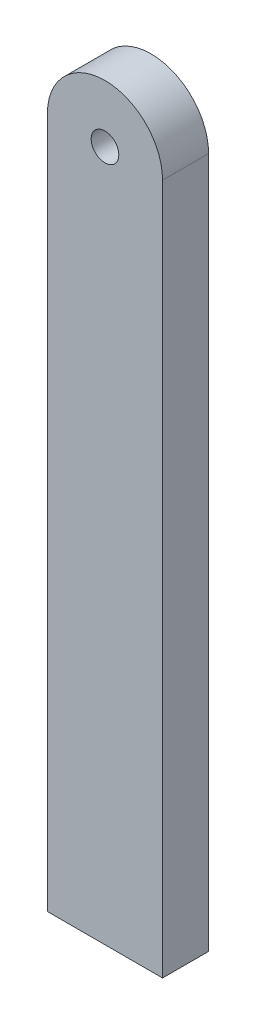
ISO-10303-21;
HEADER;
FILE_DESCRIPTION(('STEP AP214'),'2;1');
FILE_NAME('part.step','',(''),(''),'','','');
FILE_SCHEMA(('AUTOMOTIVE_DESIGN { 1 0 10303 214 1 1 1 1 }'));
ENDSEC;
DATA;
#1=APPLICATION_CONTEXT('core data for automotive mechanical design processes');
#2=APPLICATION_PROTOCOL_DEFINITION('international standard','automotive_design',2000,#1);
#3=PRODUCT_CONTEXT('',#1,'mechanical');
#4=PRODUCT('Part','Part','',(#3));
#5=PRODUCT_RELATED_PRODUCT_CATEGORY('part','',(#4));
#6=PRODUCT_DEFINITION_FORMATION('','',#4);
#7=PRODUCT_DEFINITION_CONTEXT('part definition',#1,'design');
#8=PRODUCT_DEFINITION('design','',#6,#7);
#9=PRODUCT_DEFINITION_SHAPE('','',#8);
#10=(LENGTH_UNIT() NAMED_UNIT(*) SI_UNIT(.MILLI.,.METRE.));
#11=(NAMED_UNIT(*) PLANE_ANGLE_UNIT() SI_UNIT($,.RADIAN.));
#12=(NAMED_UNIT(*) SI_UNIT($,.STERADIAN.) SOLID_ANGLE_UNIT());
#13=UNCERTAINTY_MEASURE_WITH_UNIT(LENGTH_MEASURE(1.E-05),#10,'distance_accuracy_value','');
#14=(GEOMETRIC_REPRESENTATION_CONTEXT(3) GLOBAL_UNCERTAINTY_ASSIGNED_CONTEXT((#13)) GLOBAL_UNIT_ASSIGNED_CONTEXT((#10,
#11,#12)) REPRESENTATION_CONTEXT('',''));
#15=CARTESIAN_POINT('',(0.,0.,0.));
#16=DIRECTION('',(0.,0.,1.));
#17=DIRECTION('',(1.,0.,0.));
#18=AXIS2_PLACEMENT_3D('',#15,#16,#17);
#19=CARTESIAN_POINT('',(0.,75.,10.));
#20=DIRECTION('',(0.,0.,-1.));
#21=DIRECTION('',(-1.,0.,0.));
#22=AXIS2_PLACEMENT_3D('',#19,#20,#21);
#23=PLANE('',#22);
#24=CARTESIAN_POINT('',(0.,75.,10.));
#25=DIRECTION('',(0.,0.,1.));
#26=DIRECTION('',(-1.,0.,0.));
#27=AXIS2_PLACEMENT_3D('',#24,#25,#26);
#28=CIRCLE('',#27,12.5);
#29=CARTESIAN_POINT('',(12.5,75.,10.));
#30=VERTEX_POINT('',#29);
#31=CARTESIAN_POINT('',(-12.5,75.,10.));
#32=VERTEX_POINT('',#31);
#33=EDGE_CURVE('E92',#30,#32,#28,.T.);
#34=ORIENTED_EDGE('',*,*,#33,.T.);
#35=DIRECTION('',(0.,-1.,0.));
#36=VECTOR('',#35,1.);
#37=CARTESIAN_POINT('',(-12.5,-75.,10.));
#38=LINE('',#37,#36);
#39=CARTESIAN_POINT('',(-12.5,-75.,10.));
#40=VERTEX_POINT('',#39);
#41=EDGE_CURVE('E87',#32,#40,#38,.T.);
#42=ORIENTED_EDGE('',*,*,#41,.T.);
#43=DIRECTION('',(1.,0.,0.));
#44=VECTOR('',#43,1.);
#45=CARTESIAN_POINT('',(-12.5,-75.,10.));
#46=LINE('',#45,#44);
#47=CARTESIAN_POINT('',(12.5,-75.,10.));
#48=VERTEX_POINT('',#47);
#49=EDGE_CURVE('E90',#40,#48,#46,.T.);
#50=ORIENTED_EDGE('',*,*,#49,.T.);
#51=DIRECTION('',(0.,1.,0.));
#52=VECTOR('',#51,1.);
#53=CARTESIAN_POINT('',(12.5,-75.,10.));
#54=LINE('',#53,#52);
#55=EDGE_CURVE('E57',#48,#30,#54,.T.);
#56=ORIENTED_EDGE('',*,*,#55,.T.);
#57=EDGE_LOOP('',(#34,#42,#50,#56));
#58=FACE_BOUND('',#57,.T.);
#59=CARTESIAN_POINT('',(0.,75.,10.));
#60=DIRECTION('',(0.,0.,1.));
#61=DIRECTION('',(1.,0.,0.));
#62=AXIS2_PLACEMENT_3D('',#59,#60,#61);
#63=CIRCLE('',#62,3.);
#64=CARTESIAN_POINT('',(3.,75.,10.));
#65=VERTEX_POINT('',#64);
#66=EDGE_CURVE('E112',#65,#65,#63,.T.);
#67=ORIENTED_EDGE('',*,*,#66,.F.);
#68=EDGE_LOOP('',(#67));
#69=FACE_BOUND('',#68,.T.);
#70=ADVANCED_FACE('F39',(#58,#69),#23,.F.);
#71=CARTESIAN_POINT('',(0.,75.,0.));
#72=DIRECTION('',(0.,0.,-1.));
#73=DIRECTION('',(-1.,0.,0.));
#74=AXIS2_PLACEMENT_3D('',#71,#72,#73);
#75=PLANE('',#74);
#76=CARTESIAN_POINT('',(0.,75.,0.));
#77=DIRECTION('',(0.,0.,1.));
#78=DIRECTION('',(-1.,0.,0.));
#79=AXIS2_PLACEMENT_3D('',#76,#77,#78);
#80=CIRCLE('',#79,12.5);
#81=CARTESIAN_POINT('',(12.5,75.,0.));
#82=VERTEX_POINT('',#81);
#83=CARTESIAN_POINT('',(-12.5,75.,0.));
#84=VERTEX_POINT('',#83);
#85=EDGE_CURVE('E108',#82,#84,#80,.T.);
#86=ORIENTED_EDGE('',*,*,#85,.F.);
#87=DIRECTION('',(0.,1.,0.));
#88=VECTOR('',#87,1.);
#89=CARTESIAN_POINT('',(12.5,-75.,0.));
#90=LINE('',#89,#88);
#91=CARTESIAN_POINT('',(12.5,-75.,0.));
#92=VERTEX_POINT('',#91);
#93=EDGE_CURVE('E80',#92,#82,#90,.T.);
#94=ORIENTED_EDGE('',*,*,#93,.F.);
#95=DIRECTION('',(1.,0.,0.));
#96=VECTOR('',#95,1.);
#97=CARTESIAN_POINT('',(-12.5,-75.,0.));
#98=LINE('',#97,#96);
#99=CARTESIAN_POINT('',(-12.5,-75.,0.));
#100=VERTEX_POINT('',#99);
#101=EDGE_CURVE('E74',#100,#92,#98,.T.);
#102=ORIENTED_EDGE('',*,*,#101,.F.);
#103=DIRECTION('',(0.,-1.,0.));
#104=VECTOR('',#103,1.);
#105=CARTESIAN_POINT('',(-12.5,-75.,0.));
#106=LINE('',#105,#104);
#107=EDGE_CURVE('E97',#84,#100,#106,.T.);
#108=ORIENTED_EDGE('',*,*,#107,.F.);
#109=EDGE_LOOP('',(#86,#94,#102,#108));
#110=FACE_BOUND('',#109,.T.);
#111=CARTESIAN_POINT('',(0.,75.,0.));
#112=DIRECTION('',(0.,0.,1.));
#113=DIRECTION('',(1.,0.,0.));
#114=AXIS2_PLACEMENT_3D('',#111,#112,#113);
#115=CIRCLE('',#114,3.);
#116=CARTESIAN_POINT('',(3.,75.,0.));
#117=VERTEX_POINT('',#116);
#118=EDGE_CURVE('E130',#117,#117,#115,.T.);
#119=ORIENTED_EDGE('',*,*,#118,.T.);
#120=EDGE_LOOP('',(#119));
#121=FACE_BOUND('',#120,.T.);
#122=ADVANCED_FACE('F125',(#110,#121),#75,.T.);
#123=CARTESIAN_POINT('',(0.,75.,10.));
#124=DIRECTION('',(0.,0.,-1.));
#125=DIRECTION('',(-1.,0.,0.));
#126=AXIS2_PLACEMENT_3D('',#123,#124,#125);
#127=CYLINDRICAL_SURFACE('',#126,12.5);
#128=ORIENTED_EDGE('',*,*,#85,.T.);
#129=DIRECTION('',(0.,0.,-1.));
#130=VECTOR('',#129,1.);
#131=CARTESIAN_POINT('',(-12.5,75.,10.));
#132=LINE('',#131,#130);
#133=EDGE_CURVE('E11',#32,#84,#132,.T.);
#134=ORIENTED_EDGE('',*,*,#133,.F.);
#135=ORIENTED_EDGE('',*,*,#33,.F.);
#136=DIRECTION('',(0.,0.,-1.));
#137=VECTOR('',#136,1.);
#138=CARTESIAN_POINT('',(12.5,75.,10.));
#139=LINE('',#138,#137);
#140=EDGE_CURVE('E104',#30,#82,#139,.T.);
#141=ORIENTED_EDGE('',*,*,#140,.T.);
#142=EDGE_LOOP('',(#128,#134,#135,#141));
#143=FACE_BOUND('',#142,.T.);
#144=ADVANCED_FACE('F41',(#143),#127,.T.);
#145=CARTESIAN_POINT('',(-12.5,-75.,10.));
#146=DIRECTION('',(1.,0.,0.));
#147=DIRECTION('',(0.,0.,-1.));
#148=AXIS2_PLACEMENT_3D('',#145,#146,#147);
#149=PLANE('',#148);
#150=ORIENTED_EDGE('',*,*,#107,.T.);
#151=DIRECTION('',(0.,0.,-1.));
#152=VECTOR('',#151,1.);
#153=CARTESIAN_POINT('',(-12.5,-75.,10.));
#154=LINE('',#153,#152);
#155=EDGE_CURVE('E49',#40,#100,#154,.T.);
#156=ORIENTED_EDGE('',*,*,#155,.F.);
#157=ORIENTED_EDGE('',*,*,#41,.F.);
#158=ORIENTED_EDGE('',*,*,#133,.T.);
#159=EDGE_LOOP('',(#150,#156,#157,#158));
#160=FACE_BOUND('',#159,.T.);
#161=ADVANCED_FACE('F96',(#160),#149,.F.);
#162=CARTESIAN_POINT('',(-12.5,-75.,10.));
#163=DIRECTION('',(0.,1.,0.));
#164=DIRECTION('',(0.,0.,1.));
#165=AXIS2_PLACEMENT_3D('',#162,#163,#164);
#166=PLANE('',#165);
#167=ORIENTED_EDGE('',*,*,#101,.T.);
#168=DIRECTION('',(0.,0.,-1.));
#169=VECTOR('',#168,1.);
#170=CARTESIAN_POINT('',(12.5,-75.,10.));
#171=LINE('',#170,#169);
#172=EDGE_CURVE('E99',#48,#92,#171,.T.);
#173=ORIENTED_EDGE('',*,*,#172,.F.);
#174=ORIENTED_EDGE('',*,*,#49,.F.);
#175=ORIENTED_EDGE('',*,*,#155,.T.);
#176=EDGE_LOOP('',(#167,#173,#174,#175));
#177=FACE_BOUND('',#176,.T.);
#178=ADVANCED_FACE('F100',(#177),#166,.F.);
#179=CARTESIAN_POINT('',(12.5,-75.,10.));
#180=DIRECTION('',(-1.,0.,0.));
#181=DIRECTION('',(0.,0.,1.));
#182=AXIS2_PLACEMENT_3D('',#179,#180,#181);
#183=PLANE('',#182);
#184=ORIENTED_EDGE('',*,*,#93,.T.);
#185=ORIENTED_EDGE('',*,*,#140,.F.);
#186=ORIENTED_EDGE('',*,*,#55,.F.);
#187=ORIENTED_EDGE('',*,*,#172,.T.);
#188=EDGE_LOOP('',(#184,#185,#186,#187));
#189=FACE_BOUND('',#188,.T.);
#190=ADVANCED_FACE('F122',(#189),#183,.F.);
#191=CARTESIAN_POINT('',(0.,75.,10.));
#192=DIRECTION('',(0.,0.,-1.));
#193=DIRECTION('',(-1.,0.,0.));
#194=AXIS2_PLACEMENT_3D('',#191,#192,#193);
#195=CYLINDRICAL_SURFACE('',#194,3.);
#196=ORIENTED_EDGE('',*,*,#66,.T.);
#197=EDGE_LOOP('',(#196));
#198=FACE_BOUND('',#197,.T.);
#199=ORIENTED_EDGE('',*,*,#118,.F.);
#200=EDGE_LOOP('',(#199));
#201=FACE_BOUND('',#200,.T.);
#202=ADVANCED_FACE('F138',(#198,#201),#195,.F.);
#203=CLOSED_SHELL('',(#70,#122,#144,#161,#178,#190,#202));
#204=MANIFOLD_SOLID_BREP('B2',#203);
#205=ADVANCED_BREP_SHAPE_REPRESENTATION('',(#18,#204),#14);
#206=SHAPE_DEFINITION_REPRESENTATION(#9,#205);
ENDSEC;
END-ISO-10303-21;
